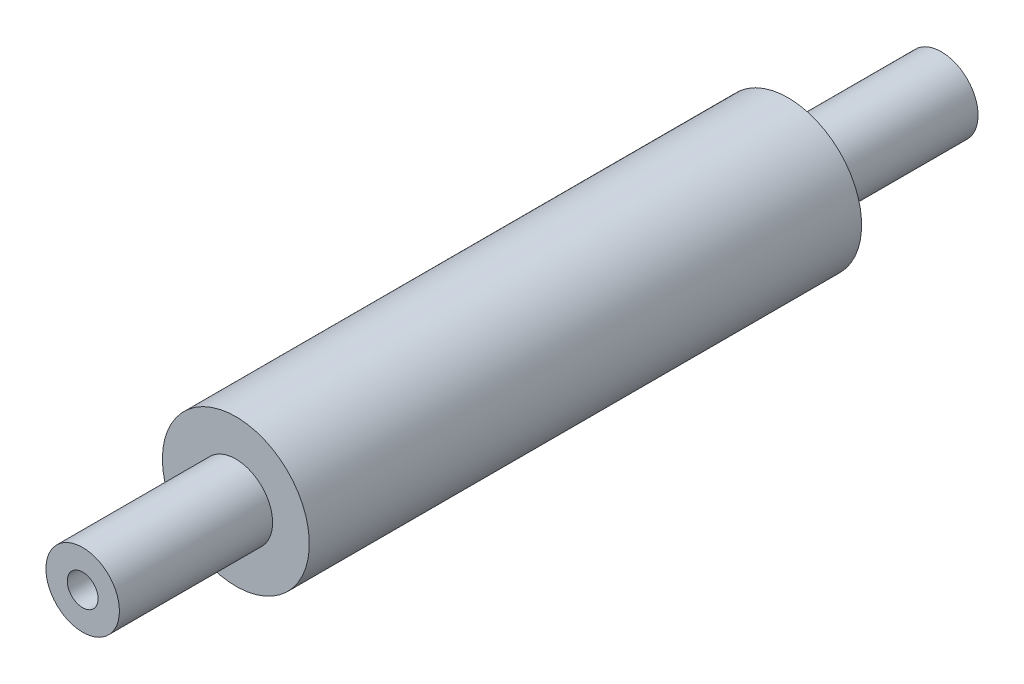
ISO-10303-21;
HEADER;
FILE_DESCRIPTION(('STEP AP214'),'2;1');
FILE_NAME('part.step','',(''),(''),'','','');
FILE_SCHEMA(('AUTOMOTIVE_DESIGN { 1 0 10303 214 1 1 1 1 }'));
ENDSEC;
DATA;
#1=APPLICATION_CONTEXT('core data for automotive mechanical design processes');
#2=APPLICATION_PROTOCOL_DEFINITION('international standard','automotive_design',2000,#1);
#3=PRODUCT_CONTEXT('',#1,'mechanical');
#4=PRODUCT('Part','Part','',(#3));
#5=PRODUCT_RELATED_PRODUCT_CATEGORY('part','',(#4));
#6=PRODUCT_DEFINITION_FORMATION('','',#4);
#7=PRODUCT_DEFINITION_CONTEXT('part definition',#1,'design');
#8=PRODUCT_DEFINITION('design','',#6,#7);
#9=PRODUCT_DEFINITION_SHAPE('','',#8);
#10=(LENGTH_UNIT() NAMED_UNIT(*) SI_UNIT(.MILLI.,.METRE.));
#11=(NAMED_UNIT(*) PLANE_ANGLE_UNIT() SI_UNIT($,.RADIAN.));
#12=(NAMED_UNIT(*) SI_UNIT($,.STERADIAN.) SOLID_ANGLE_UNIT());
#13=UNCERTAINTY_MEASURE_WITH_UNIT(LENGTH_MEASURE(1.E-05),#10,'distance_accuracy_value','');
#14=(GEOMETRIC_REPRESENTATION_CONTEXT(3) GLOBAL_UNCERTAINTY_ASSIGNED_CONTEXT((#13)) GLOBAL_UNIT_ASSIGNED_CONTEXT((#10,
#11,#12)) REPRESENTATION_CONTEXT('',''));
#15=CARTESIAN_POINT('',(0.,0.,0.));
#16=DIRECTION('',(0.,0.,1.));
#17=DIRECTION('',(1.,0.,0.));
#18=AXIS2_PLACEMENT_3D('',#15,#16,#17);
#19=CARTESIAN_POINT('',(0.,0.,71.6));
#20=DIRECTION('',(0.,0.,-1.));
#21=DIRECTION('',(-1.,0.,0.));
#22=AXIS2_PLACEMENT_3D('',#19,#20,#21);
#23=CYLINDRICAL_SURFACE('',#22,9.525);
#24=CARTESIAN_POINT('',(0.,0.,71.6));
#25=DIRECTION('',(0.,0.,1.));
#26=DIRECTION('',(1.,0.,0.));
#27=AXIS2_PLACEMENT_3D('',#24,#25,#26);
#28=CIRCLE('',#27,9.525);
#29=CARTESIAN_POINT('',(-9.525,0.,71.6));
#30=VERTEX_POINT('',#29);
#31=EDGE_CURVE('E51',#30,#30,#28,.T.);
#32=CARTESIAN_POINT('',(0.,0.,0.));
#33=DIRECTION('',(0.,0.,1.));
#34=DIRECTION('',(1.,0.,0.));
#35=AXIS2_PLACEMENT_3D('',#32,#33,#34);
#36=CIRCLE('',#35,9.525);
#37=CARTESIAN_POINT('',(-9.525,0.,0.));
#38=VERTEX_POINT('',#37);
#39=EDGE_CURVE('E42',#38,#38,#36,.T.);
#40=CARTESIAN_POINT('',(-9.525,0.,71.6));
#41=CARTESIAN_POINT('',(-9.525,0.,70.8541666666666));
#42=CARTESIAN_POINT('',(-9.525,0.,70.1083333333333));
#43=CARTESIAN_POINT('',(-9.525,0.,68.6166666666667));
#44=CARTESIAN_POINT('',(-9.525,0.,67.8708333333333));
#45=CARTESIAN_POINT('',(-9.525,0.,66.3791666666667));
#46=CARTESIAN_POINT('',(-9.525,0.,65.6333333333333));
#47=CARTESIAN_POINT('',(-9.525,0.,64.1416666666667));
#48=CARTESIAN_POINT('',(-9.525,0.,63.3958333333333));
#49=CARTESIAN_POINT('',(-9.525,0.,61.9041666666667));
#50=CARTESIAN_POINT('',(-9.525,0.,61.1583333333333));
#51=CARTESIAN_POINT('',(-9.525,0.,59.6666666666667));
#52=CARTESIAN_POINT('',(-9.525,0.,58.9208333333333));
#53=CARTESIAN_POINT('',(-9.525,0.,57.4291666666667));
#54=CARTESIAN_POINT('',(-9.525,0.,56.6833333333333));
#55=CARTESIAN_POINT('',(-9.525,0.,55.1916666666667));
#56=CARTESIAN_POINT('',(-9.525,0.,54.4458333333333));
#57=CARTESIAN_POINT('',(-9.525,0.,52.9541666666667));
#58=CARTESIAN_POINT('',(-9.525,0.,52.2083333333333));
#59=CARTESIAN_POINT('',(-9.525,0.,50.7166666666667));
#60=CARTESIAN_POINT('',(-9.525,0.,49.9708333333333));
#61=CARTESIAN_POINT('',(-9.525,0.,48.4791666666667));
#62=CARTESIAN_POINT('',(-9.525,0.,47.7333333333333));
#63=CARTESIAN_POINT('',(-9.525,0.,46.2416666666667));
#64=CARTESIAN_POINT('',(-9.525,0.,45.4958333333333));
#65=CARTESIAN_POINT('',(-9.525,0.,44.0041666666666));
#66=CARTESIAN_POINT('',(-9.525,0.,43.2583333333333));
#67=CARTESIAN_POINT('',(-9.525,0.,41.7666666666667));
#68=CARTESIAN_POINT('',(-9.525,0.,41.0208333333333));
#69=CARTESIAN_POINT('',(-9.525,0.,39.5291666666667));
#70=CARTESIAN_POINT('',(-9.525,0.,38.7833333333333));
#71=CARTESIAN_POINT('',(-9.525,0.,37.2916666666667));
#72=CARTESIAN_POINT('',(-9.525,0.,36.5458333333333));
#73=CARTESIAN_POINT('',(-9.525,0.,35.0541666666667));
#74=CARTESIAN_POINT('',(-9.525,0.,34.3083333333333));
#75=CARTESIAN_POINT('',(-9.525,0.,32.8166666666667));
#76=CARTESIAN_POINT('',(-9.525,0.,32.0708333333333));
#77=CARTESIAN_POINT('',(-9.525,0.,30.5791666666667));
#78=CARTESIAN_POINT('',(-9.525,0.,29.8333333333333));
#79=CARTESIAN_POINT('',(-9.525,0.,28.3416666666667));
#80=CARTESIAN_POINT('',(-9.525,0.,27.5958333333333));
#81=CARTESIAN_POINT('',(-9.525,0.,26.1041666666667));
#82=CARTESIAN_POINT('',(-9.525,0.,25.3583333333333));
#83=CARTESIAN_POINT('',(-9.525,0.,23.8666666666667));
#84=CARTESIAN_POINT('',(-9.525,0.,23.1208333333333));
#85=CARTESIAN_POINT('',(-9.525,0.,21.6291666666667));
#86=CARTESIAN_POINT('',(-9.525,0.,20.8833333333333));
#87=CARTESIAN_POINT('',(-9.525,0.,19.3916666666667));
#88=CARTESIAN_POINT('',(-9.525,0.,18.6458333333333));
#89=CARTESIAN_POINT('',(-9.525,0.,17.1541666666667));
#90=CARTESIAN_POINT('',(-9.525,0.,16.4083333333333));
#91=CARTESIAN_POINT('',(-9.525,0.,14.9166666666667));
#92=CARTESIAN_POINT('',(-9.525,0.,14.1708333333333));
#93=CARTESIAN_POINT('',(-9.525,0.,12.6791666666667));
#94=CARTESIAN_POINT('',(-9.525,0.,11.9333333333333));
#95=CARTESIAN_POINT('',(-9.525,0.,10.4416666666667));
#96=CARTESIAN_POINT('',(-9.525,0.,9.69583333333332));
#97=CARTESIAN_POINT('',(-9.525,0.,8.20416666666665));
#98=CARTESIAN_POINT('',(-9.525,0.,7.45833333333332));
#99=CARTESIAN_POINT('',(-9.525,0.,5.96666666666665));
#100=CARTESIAN_POINT('',(-9.525,0.,5.22083333333332));
#101=CARTESIAN_POINT('',(-9.525,0.,3.72916666666666));
#102=CARTESIAN_POINT('',(-9.525,0.,2.98333333333332));
#103=CARTESIAN_POINT('',(-9.525,0.,1.49166666666666));
#104=CARTESIAN_POINT('',(-9.525,0.,0.74583333333332));
#105=CARTESIAN_POINT('',(-9.525,0.,0.));
#106=B_SPLINE_CURVE_WITH_KNOTS('',3,(#40,#41,#42,#43,#44,#45,#46,#47,#48,#49,#50,#51,#52,#53,
#54,#55,#56,#57,#58,#59,#60,#61,#62,#63,#64,#65,#66,#67,#68,#69,#70,#71,#72,#73,#74,#75,#76,#77,
#78,#79,#80,#81,#82,#83,#84,#85,#86,#87,#88,#89,#90,#91,#92,#93,#94,#95,#96,#97,#98,#99,#100,
#101,#102,#103,#104,#105),.UNSPECIFIED.,.F.,.F.,(4,2,2,2,2,2,2,2,2,2,2,2,2,2,2,2,2,2,2,2,2,2,2,
2,2,2,2,2,2,2,2,2,4),(0.,2.23749999999999,4.47499999999999,6.7125,8.95,11.1875,13.425,15.6625,
17.9,20.1375,22.375,24.6125,26.85,29.0875,31.325,33.5625,35.8,38.0375,40.275,42.5125,44.75,
46.9875,49.225,51.4625,53.7,55.9375,58.175,60.4125,62.65,64.8875,67.125,69.3625,71.6),.UNSPECIFIED.);
#107=EDGE_CURVE('BSEAM39',#30,#38,#106,.T.);
#108=ORIENTED_EDGE('',*,*,#31,.F.);
#109=ORIENTED_EDGE('',*,*,#39,.T.);
#110=ORIENTED_EDGE('',*,*,#107,.T.);
#111=ORIENTED_EDGE('',*,*,#107,.F.);
#112=EDGE_LOOP('',(#108,#110,#109,#111));
#113=FACE_BOUND('',#112,.T.);
#114=ADVANCED_FACE('F39',(#113),#23,.T.);
#115=CARTESIAN_POINT('',(0.,0.,71.6));
#116=DIRECTION('',(0.,0.,1.));
#117=DIRECTION('',(1.,0.,0.));
#118=AXIS2_PLACEMENT_3D('',#115,#116,#117);
#119=PLANE('',#118);
#120=CARTESIAN_POINT('',(0.,0.,71.6));
#121=DIRECTION('',(0.,0.,1.));
#122=DIRECTION('',(1.,0.,0.));
#123=AXIS2_PLACEMENT_3D('',#120,#121,#122);
#124=CIRCLE('',#123,4.7625);
#125=CARTESIAN_POINT('',(4.7625,0.,71.6));
#126=VERTEX_POINT('',#125);
#127=EDGE_CURVE('E46',#126,#126,#124,.T.);
#128=ORIENTED_EDGE('',*,*,#127,.F.);
#129=EDGE_LOOP('',(#128));
#130=FACE_BOUND('',#129,.T.);
#131=ORIENTED_EDGE('',*,*,#31,.T.);
#132=EDGE_LOOP('',(#131));
#133=FACE_BOUND('',#132,.T.);
#134=ADVANCED_FACE('F69',(#130,#133),#119,.T.);
#135=CARTESIAN_POINT('',(0.,0.,0.));
#136=DIRECTION('',(0.,0.,1.));
#137=DIRECTION('',(1.,0.,0.));
#138=AXIS2_PLACEMENT_3D('',#135,#136,#137);
#139=PLANE('',#138);
#140=CARTESIAN_POINT('',(0.,0.,0.));
#141=DIRECTION('',(0.,0.,-1.));
#142=DIRECTION('',(-1.,0.,0.));
#143=AXIS2_PLACEMENT_3D('',#140,#141,#142);
#144=CIRCLE('',#143,4.7625);
#145=CARTESIAN_POINT('',(-4.7625,0.,0.));
#146=VERTEX_POINT('',#145);
#147=EDGE_CURVE('E10',#146,#146,#144,.T.);
#148=ORIENTED_EDGE('',*,*,#147,.F.);
#149=EDGE_LOOP('',(#148));
#150=FACE_BOUND('',#149,.T.);
#151=ORIENTED_EDGE('',*,*,#39,.F.);
#152=EDGE_LOOP('',(#151));
#153=FACE_BOUND('',#152,.T.);
#154=ADVANCED_FACE('F66',(#150,#153),#139,.F.);
#155=CARTESIAN_POINT('',(0.,0.,91.46));
#156=DIRECTION('',(0.,0.,-1.));
#157=DIRECTION('',(-1.,0.,0.));
#158=AXIS2_PLACEMENT_3D('',#155,#156,#157);
#159=CYLINDRICAL_SURFACE('',#158,4.7625);
#160=CARTESIAN_POINT('',(0.,0.,91.46));
#161=DIRECTION('',(0.,0.,1.));
#162=DIRECTION('',(1.,0.,0.));
#163=AXIS2_PLACEMENT_3D('',#160,#161,#162);
#164=CIRCLE('',#163,4.7625);
#165=CARTESIAN_POINT('',(4.7625,0.,91.46));
#166=VERTEX_POINT('',#165);
#167=EDGE_CURVE('E57',#166,#166,#164,.T.);
#168=ORIENTED_EDGE('',*,*,#167,.F.);
#169=EDGE_LOOP('',(#168));
#170=FACE_BOUND('',#169,.T.);
#171=ORIENTED_EDGE('',*,*,#127,.T.);
#172=EDGE_LOOP('',(#171));
#173=FACE_BOUND('',#172,.T.);
#174=ADVANCED_FACE('F68',(#170,#173),#159,.T.);
#175=CARTESIAN_POINT('',(0.,0.,91.46));
#176=DIRECTION('',(0.,0.,1.));
#177=DIRECTION('',(1.,0.,0.));
#178=AXIS2_PLACEMENT_3D('',#175,#176,#177);
#179=PLANE('',#178);
#180=CARTESIAN_POINT('',(0.,0.,91.46));
#181=DIRECTION('',(0.,0.,1.));
#182=DIRECTION('',(1.,0.,0.));
#183=AXIS2_PLACEMENT_3D('',#180,#181,#182);
#184=CIRCLE('',#183,2.);
#185=CARTESIAN_POINT('',(2.,0.,91.46));
#186=VERTEX_POINT('',#185);
#187=EDGE_CURVE('E174',#186,#186,#184,.T.);
#188=ORIENTED_EDGE('',*,*,#187,.F.);
#189=EDGE_LOOP('',(#188));
#190=FACE_BOUND('',#189,.T.);
#191=ORIENTED_EDGE('',*,*,#167,.T.);
#192=EDGE_LOOP('',(#191));
#193=FACE_BOUND('',#192,.T.);
#194=ADVANCED_FACE('F75',(#190,#193),#179,.T.);
#195=CARTESIAN_POINT('',(0.,0.,-19.86));
#196=DIRECTION('',(0.,0.,1.));
#197=DIRECTION('',(1.,0.,0.));
#198=AXIS2_PLACEMENT_3D('',#195,#196,#197);
#199=CYLINDRICAL_SURFACE('',#198,4.7625);
#200=CARTESIAN_POINT('',(0.,0.,-19.86));
#201=DIRECTION('',(0.,0.,-1.));
#202=DIRECTION('',(-1.,0.,0.));
#203=AXIS2_PLACEMENT_3D('',#200,#201,#202);
#204=CIRCLE('',#203,4.7625);
#205=CARTESIAN_POINT('',(-4.7625,0.,-19.86));
#206=VERTEX_POINT('',#205);
#207=EDGE_CURVE('E55',#206,#206,#204,.T.);
#208=ORIENTED_EDGE('',*,*,#207,.F.);
#209=EDGE_LOOP('',(#208));
#210=FACE_BOUND('',#209,.T.);
#211=ORIENTED_EDGE('',*,*,#147,.T.);
#212=EDGE_LOOP('',(#211));
#213=FACE_BOUND('',#212,.T.);
#214=ADVANCED_FACE('F108',(#210,#213),#199,.T.);
#215=CARTESIAN_POINT('',(0.,0.,-19.86));
#216=DIRECTION('',(0.,0.,-1.));
#217=DIRECTION('',(-1.,0.,0.));
#218=AXIS2_PLACEMENT_3D('',#215,#216,#217);
#219=PLANE('',#218);
#220=CARTESIAN_POINT('',(0.,0.,-19.86));
#221=DIRECTION('',(0.,0.,-1.));
#222=DIRECTION('',(-1.,0.,0.));
#223=AXIS2_PLACEMENT_3D('',#220,#221,#222);
#224=CIRCLE('',#223,2.);
#225=CARTESIAN_POINT('',(-2.,0.,-19.86));
#226=VERTEX_POINT('',#225);
#227=EDGE_CURVE('E173',#226,#226,#224,.T.);
#228=ORIENTED_EDGE('',*,*,#227,.F.);
#229=EDGE_LOOP('',(#228));
#230=FACE_BOUND('',#229,.T.);
#231=ORIENTED_EDGE('',*,*,#207,.T.);
#232=EDGE_LOOP('',(#231));
#233=FACE_BOUND('',#232,.T.);
#234=ADVANCED_FACE('F119',(#230,#233),#219,.T.);
#235=CARTESIAN_POINT('',(0.,0.,-14.86));
#236=DIRECTION('',(0.,0.,-1.));
#237=DIRECTION('',(-1.,0.,0.));
#238=AXIS2_PLACEMENT_3D('',#235,#236,#237);
#239=CYLINDRICAL_SURFACE('',#238,2.);
#240=CARTESIAN_POINT('',(0.,0.,-14.86));
#241=DIRECTION('',(0.,0.,-1.));
#242=DIRECTION('',(-1.,0.,0.));
#243=AXIS2_PLACEMENT_3D('',#240,#241,#242);
#244=CIRCLE('',#243,2.);
#245=CARTESIAN_POINT('',(-2.,0.,-14.86));
#246=VERTEX_POINT('',#245);
#247=EDGE_CURVE('E177',#246,#246,#244,.T.);
#248=ORIENTED_EDGE('',*,*,#247,.F.);
#249=EDGE_LOOP('',(#248));
#250=FACE_BOUND('',#249,.T.);
#251=ORIENTED_EDGE('',*,*,#227,.T.);
#252=EDGE_LOOP('',(#251));
#253=FACE_BOUND('',#252,.T.);
#254=ADVANCED_FACE('F129',(#250,#253),#239,.F.);
#255=CARTESIAN_POINT('',(0.,0.,-14.86));
#256=DIRECTION('',(0.,0.,-1.));
#257=DIRECTION('',(-1.,0.,0.));
#258=AXIS2_PLACEMENT_3D('',#255,#256,#257);
#259=PLANE('',#258);
#260=ORIENTED_EDGE('',*,*,#247,.T.);
#261=EDGE_LOOP('',(#260));
#262=FACE_BOUND('',#261,.T.);
#263=ADVANCED_FACE('F139',(#262),#259,.T.);
#264=CARTESIAN_POINT('',(0.,0.,86.46));
#265=DIRECTION('',(0.,0.,1.));
#266=DIRECTION('',(1.,0.,0.));
#267=AXIS2_PLACEMENT_3D('',#264,#265,#266);
#268=CYLINDRICAL_SURFACE('',#267,2.);
#269=CARTESIAN_POINT('',(0.,0.,86.46));
#270=DIRECTION('',(0.,0.,1.));
#271=DIRECTION('',(1.,0.,0.));
#272=AXIS2_PLACEMENT_3D('',#269,#270,#271);
#273=CIRCLE('',#272,2.);
#274=CARTESIAN_POINT('',(2.,0.,86.46));
#275=VERTEX_POINT('',#274);
#276=EDGE_CURVE('E172',#275,#275,#273,.T.);
#277=ORIENTED_EDGE('',*,*,#276,.F.);
#278=EDGE_LOOP('',(#277));
#279=FACE_BOUND('',#278,.T.);
#280=ORIENTED_EDGE('',*,*,#187,.T.);
#281=EDGE_LOOP('',(#280));
#282=FACE_BOUND('',#281,.T.);
#283=ADVANCED_FACE('F148',(#279,#282),#268,.F.);
#284=CARTESIAN_POINT('',(0.,0.,86.46));
#285=DIRECTION('',(0.,0.,1.));
#286=DIRECTION('',(1.,0.,0.));
#287=AXIS2_PLACEMENT_3D('',#284,#285,#286);
#288=PLANE('',#287);
#289=ORIENTED_EDGE('',*,*,#276,.T.);
#290=EDGE_LOOP('',(#289));
#291=FACE_BOUND('',#290,.T.);
#292=ADVANCED_FACE('F157',(#291),#288,.T.);
#293=CLOSED_SHELL('',(#114,#134,#154,#174,#194,#214,#234,#254,#263,#283,#292));
#294=MANIFOLD_SOLID_BREP('B2',#293);
#295=ADVANCED_BREP_SHAPE_REPRESENTATION('',(#18,#294),#14);
#296=SHAPE_DEFINITION_REPRESENTATION(#9,#295);
ENDSEC;
END-ISO-10303-21;
